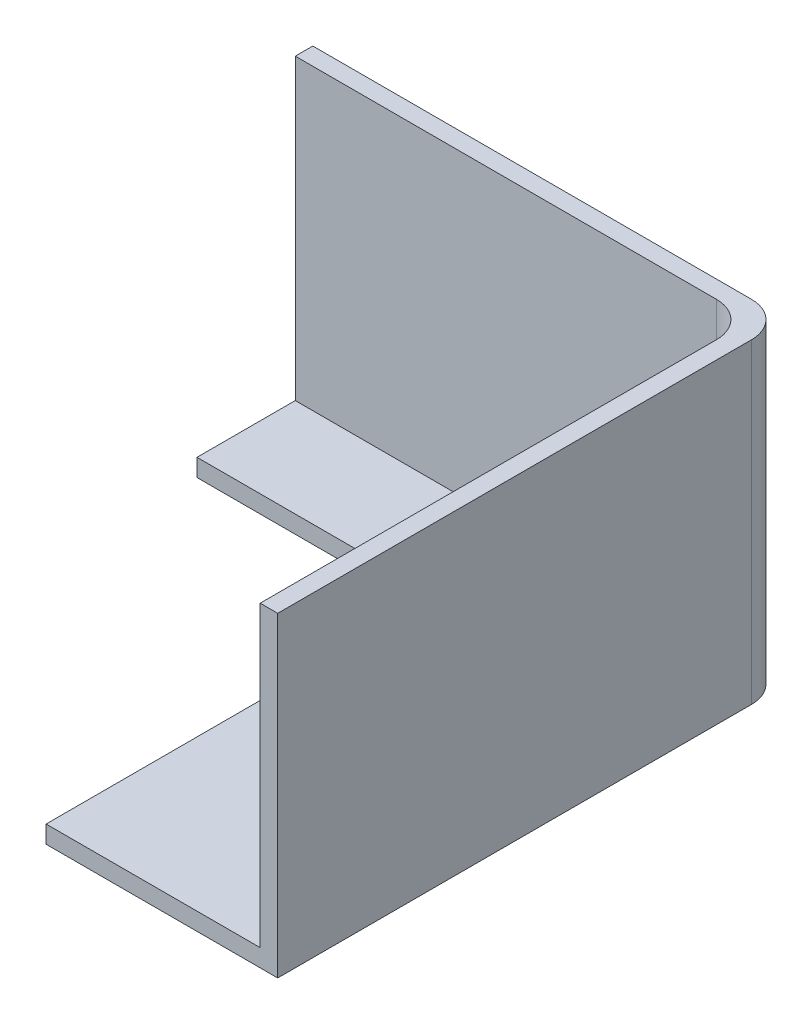
ISO-10303-21;
HEADER;
FILE_DESCRIPTION(('STEP AP214'),'2;1');
FILE_NAME('part.step','',(''),(''),'','','');
FILE_SCHEMA(('AUTOMOTIVE_DESIGN { 1 0 10303 214 1 1 1 1 }'));
ENDSEC;
DATA;
#1=APPLICATION_CONTEXT('core data for automotive mechanical design processes');
#2=APPLICATION_PROTOCOL_DEFINITION('international standard','automotive_design',2000,#1);
#3=PRODUCT_CONTEXT('',#1,'mechanical');
#4=PRODUCT('Part','Part','',(#3));
#5=PRODUCT_RELATED_PRODUCT_CATEGORY('part','',(#4));
#6=PRODUCT_DEFINITION_FORMATION('','',#4);
#7=PRODUCT_DEFINITION_CONTEXT('part definition',#1,'design');
#8=PRODUCT_DEFINITION('design','',#6,#7);
#9=PRODUCT_DEFINITION_SHAPE('','',#8);
#10=(LENGTH_UNIT() NAMED_UNIT(*) SI_UNIT(.MILLI.,.METRE.));
#11=(NAMED_UNIT(*) PLANE_ANGLE_UNIT() SI_UNIT($,.RADIAN.));
#12=(NAMED_UNIT(*) SI_UNIT($,.STERADIAN.) SOLID_ANGLE_UNIT());
#13=UNCERTAINTY_MEASURE_WITH_UNIT(LENGTH_MEASURE(1.E-05),#10,'distance_accuracy_value','');
#14=(GEOMETRIC_REPRESENTATION_CONTEXT(3) GLOBAL_UNCERTAINTY_ASSIGNED_CONTEXT((#13)) GLOBAL_UNIT_ASSIGNED_CONTEXT((#10,
#11,#12)) REPRESENTATION_CONTEXT('',''));
#15=CARTESIAN_POINT('',(0.,0.,0.));
#16=DIRECTION('',(0.,0.,1.));
#17=DIRECTION('',(1.,0.,0.));
#18=AXIS2_PLACEMENT_3D('',#15,#16,#17);
#19=CARTESIAN_POINT('',(0.,90.,0.));
#20=DIRECTION('',(1.,0.,0.));
#21=DIRECTION('',(0.,0.,-1.));
#22=AXIS2_PLACEMENT_3D('',#19,#20,#21);
#23=PLANE('',#22);
#24=DIRECTION('',(0.,0.,1.));
#25=VECTOR('',#24,1.);
#26=CARTESIAN_POINT('',(0.,0.,0.));
#27=LINE('',#26,#25);
#28=CARTESIAN_POINT('',(0.,0.,0.));
#29=VERTEX_POINT('',#28);
#30=CARTESIAN_POINT('',(0.,0.,33.));
#31=VERTEX_POINT('',#30);
#32=EDGE_CURVE('E155',#29,#31,#27,.T.);
#33=ORIENTED_EDGE('',*,*,#32,.T.);
#34=DIRECTION('',(0.,1.,0.));
#35=VECTOR('',#34,1.);
#36=CARTESIAN_POINT('',(0.,-131.54847015454,33.));
#37=LINE('',#36,#35);
#38=CARTESIAN_POINT('',(0.,5.,33.));
#39=VERTEX_POINT('',#38);
#40=EDGE_CURVE('E140',#31,#39,#37,.T.);
#41=ORIENTED_EDGE('',*,*,#40,.T.);
#42=DIRECTION('',(0.,0.,-1.));
#43=VECTOR('',#42,1.);
#44=CARTESIAN_POINT('',(0.,5.,5.));
#45=LINE('',#44,#43);
#46=CARTESIAN_POINT('',(0.,5.,5.));
#47=VERTEX_POINT('',#46);
#48=EDGE_CURVE('E152',#39,#47,#45,.T.);
#49=ORIENTED_EDGE('',*,*,#48,.T.);
#50=DIRECTION('',(0.,1.,0.));
#51=VECTOR('',#50,1.);
#52=CARTESIAN_POINT('',(0.,-191.049731745428,5.));
#53=LINE('',#52,#51);
#54=CARTESIAN_POINT('',(0.,90.,5.));
#55=VERTEX_POINT('',#54);
#56=EDGE_CURVE('E181',#47,#55,#53,.T.);
#57=ORIENTED_EDGE('',*,*,#56,.T.);
#58=DIRECTION('',(0.,0.,1.));
#59=VECTOR('',#58,1.);
#60=CARTESIAN_POINT('',(0.,90.,0.));
#61=LINE('',#60,#59);
#62=CARTESIAN_POINT('',(0.,90.,0.));
#63=VERTEX_POINT('',#62);
#64=EDGE_CURVE('E186',#63,#55,#61,.T.);
#65=ORIENTED_EDGE('',*,*,#64,.F.);
#66=DIRECTION('',(0.,-1.,0.));
#67=VECTOR('',#66,1.);
#68=CARTESIAN_POINT('',(0.,90.,0.));
#69=LINE('',#68,#67);
#70=EDGE_CURVE('E201',#63,#29,#69,.T.);
#71=ORIENTED_EDGE('',*,*,#70,.T.);
#72=EDGE_LOOP('',(#33,#41,#49,#57,#65,#71));
#73=FACE_BOUND('',#72,.T.);
#74=ADVANCED_FACE('F45',(#73),#23,.F.);
#75=CARTESIAN_POINT('',(0.,90.,145.));
#76=DIRECTION('',(0.,0.,-1.));
#77=DIRECTION('',(-1.,0.,0.));
#78=AXIS2_PLACEMENT_3D('',#75,#76,#77);
#79=PLANE('',#78);
#80=DIRECTION('',(-1.,0.,0.));
#81=VECTOR('',#80,1.);
#82=CARTESIAN_POINT('',(0.,5.,145.));
#83=LINE('',#82,#81);
#84=CARTESIAN_POINT('',(130.,5.,145.));
#85=VERTEX_POINT('',#84);
#86=CARTESIAN_POINT('',(69.,5.,145.));
#87=VERTEX_POINT('',#86);
#88=EDGE_CURVE('E163',#85,#87,#83,.T.);
#89=ORIENTED_EDGE('',*,*,#88,.T.);
#90=DIRECTION('',(0.,1.,0.));
#91=VECTOR('',#90,1.);
#92=CARTESIAN_POINT('',(69.,-131.54847015454,145.));
#93=LINE('',#92,#91);
#94=CARTESIAN_POINT('',(69.,0.,145.));
#95=VERTEX_POINT('',#94);
#96=EDGE_CURVE('E146',#95,#87,#93,.T.);
#97=ORIENTED_EDGE('',*,*,#96,.F.);
#98=DIRECTION('',(1.,0.,0.));
#99=VECTOR('',#98,1.);
#100=CARTESIAN_POINT('',(0.,0.,145.));
#101=LINE('',#100,#99);
#102=CARTESIAN_POINT('',(135.,0.,145.));
#103=VERTEX_POINT('',#102);
#104=EDGE_CURVE('E204',#95,#103,#101,.T.);
#105=ORIENTED_EDGE('',*,*,#104,.T.);
#106=DIRECTION('',(0.,-1.,0.));
#107=VECTOR('',#106,1.);
#108=CARTESIAN_POINT('',(135.,90.,145.));
#109=LINE('',#108,#107);
#110=CARTESIAN_POINT('',(135.,90.,145.));
#111=VERTEX_POINT('',#110);
#112=EDGE_CURVE('E215',#111,#103,#109,.T.);
#113=ORIENTED_EDGE('',*,*,#112,.F.);
#114=DIRECTION('',(1.,0.,0.));
#115=VECTOR('',#114,1.);
#116=CARTESIAN_POINT('',(0.,90.,145.));
#117=LINE('',#116,#115);
#118=CARTESIAN_POINT('',(130.,90.,145.));
#119=VERTEX_POINT('',#118);
#120=EDGE_CURVE('E190',#119,#111,#117,.T.);
#121=ORIENTED_EDGE('',*,*,#120,.F.);
#122=DIRECTION('',(0.,1.,0.));
#123=VECTOR('',#122,1.);
#124=CARTESIAN_POINT('',(130.,-191.049731745428,145.));
#125=LINE('',#124,#123);
#126=EDGE_CURVE('E180',#85,#119,#125,.T.);
#127=ORIENTED_EDGE('',*,*,#126,.F.);
#128=EDGE_LOOP('',(#89,#97,#105,#113,#121,#127));
#129=FACE_BOUND('',#128,.T.);
#130=ADVANCED_FACE('F281',(#129),#79,.F.);
#131=CARTESIAN_POINT('',(135.,90.,0.));
#132=DIRECTION('',(-1.,0.,0.));
#133=DIRECTION('',(0.,0.,1.));
#134=AXIS2_PLACEMENT_3D('',#131,#132,#133);
#135=PLANE('',#134);
#136=DIRECTION('',(0.,0.,-1.));
#137=VECTOR('',#136,1.);
#138=CARTESIAN_POINT('',(135.,0.,0.));
#139=LINE('',#138,#137);
#140=CARTESIAN_POINT('',(135.,0.,10.));
#141=VERTEX_POINT('',#140);
#142=EDGE_CURVE('E207',#103,#141,#139,.T.);
#143=ORIENTED_EDGE('',*,*,#142,.T.);
#144=DIRECTION('',(0.,-1.,0.));
#145=VECTOR('',#144,1.);
#146=CARTESIAN_POINT('',(135.,90.,10.));
#147=LINE('',#146,#145);
#148=CARTESIAN_POINT('',(135.,90.,10.));
#149=VERTEX_POINT('',#148);
#150=EDGE_CURVE('E231',#141,#149,#147,.F.);
#151=ORIENTED_EDGE('',*,*,#150,.T.);
#152=DIRECTION('',(0.,0.,-1.));
#153=VECTOR('',#152,1.);
#154=CARTESIAN_POINT('',(135.,90.,0.));
#155=LINE('',#154,#153);
#156=EDGE_CURVE('E194',#111,#149,#155,.T.);
#157=ORIENTED_EDGE('',*,*,#156,.F.);
#158=ORIENTED_EDGE('',*,*,#112,.T.);
#159=EDGE_LOOP('',(#143,#151,#157,#158));
#160=FACE_BOUND('',#159,.T.);
#161=ADVANCED_FACE('F303',(#160),#135,.F.);
#162=CARTESIAN_POINT('',(0.,90.,0.));
#163=DIRECTION('',(0.,0.,1.));
#164=DIRECTION('',(1.,0.,0.));
#165=AXIS2_PLACEMENT_3D('',#162,#163,#164);
#166=PLANE('',#165);
#167=DIRECTION('',(-1.,0.,0.));
#168=VECTOR('',#167,1.);
#169=CARTESIAN_POINT('',(0.,90.,0.));
#170=LINE('',#169,#168);
#171=CARTESIAN_POINT('',(125.,90.,0.));
#172=VERTEX_POINT('',#171);
#173=EDGE_CURVE('E198',#172,#63,#170,.T.);
#174=ORIENTED_EDGE('',*,*,#173,.F.);
#175=DIRECTION('',(0.,-1.,0.));
#176=VECTOR('',#175,1.);
#177=CARTESIAN_POINT('',(125.,90.,0.));
#178=LINE('',#177,#176);
#179=CARTESIAN_POINT('',(125.,0.,0.));
#180=VERTEX_POINT('',#179);
#181=EDGE_CURVE('E224',#172,#180,#178,.T.);
#182=ORIENTED_EDGE('',*,*,#181,.T.);
#183=DIRECTION('',(-1.,0.,0.));
#184=VECTOR('',#183,1.);
#185=CARTESIAN_POINT('',(0.,0.,0.));
#186=LINE('',#185,#184);
#187=EDGE_CURVE('E191',#180,#29,#186,.T.);
#188=ORIENTED_EDGE('',*,*,#187,.T.);
#189=ORIENTED_EDGE('',*,*,#70,.F.);
#190=EDGE_LOOP('',(#174,#182,#188,#189));
#191=FACE_BOUND('',#190,.T.);
#192=ADVANCED_FACE('F297',(#191),#166,.F.);
#193=CARTESIAN_POINT('',(0.,90.,0.));
#194=DIRECTION('',(0.,1.,0.));
#195=DIRECTION('',(0.,0.,1.));
#196=AXIS2_PLACEMENT_3D('',#193,#194,#195);
#197=PLANE('',#196);
#198=ORIENTED_EDGE('',*,*,#156,.T.);
#199=CARTESIAN_POINT('',(125.,90.,10.));
#200=DIRECTION('',(0.,1.,0.));
#201=DIRECTION('',(0.,0.,1.));
#202=AXIS2_PLACEMENT_3D('',#199,#200,#201);
#203=CIRCLE('',#202,10.);
#204=EDGE_CURVE('E234',#149,#172,#203,.T.);
#205=ORIENTED_EDGE('',*,*,#204,.T.);
#206=ORIENTED_EDGE('',*,*,#173,.T.);
#207=ORIENTED_EDGE('',*,*,#64,.T.);
#208=DIRECTION('',(-1.,0.,0.));
#209=VECTOR('',#208,1.);
#210=CARTESIAN_POINT('',(0.,90.,5.));
#211=LINE('',#210,#209);
#212=CARTESIAN_POINT('',(120.,90.,5.));
#213=VERTEX_POINT('',#212);
#214=EDGE_CURVE('E176',#213,#55,#211,.T.);
#215=ORIENTED_EDGE('',*,*,#214,.F.);
#216=CARTESIAN_POINT('',(120.,90.,15.));
#217=DIRECTION('',(0.,1.,0.));
#218=DIRECTION('',(0.,0.,1.));
#219=AXIS2_PLACEMENT_3D('',#216,#217,#218);
#220=CIRCLE('',#219,10.);
#221=CARTESIAN_POINT('',(130.,90.,15.));
#222=VERTEX_POINT('',#221);
#223=EDGE_CURVE('E12',#213,#222,#220,.F.);
#224=ORIENTED_EDGE('',*,*,#223,.T.);
#225=DIRECTION('',(0.,0.,-1.));
#226=VECTOR('',#225,1.);
#227=CARTESIAN_POINT('',(130.,90.,5.));
#228=LINE('',#227,#226);
#229=EDGE_CURVE('E173',#119,#222,#228,.T.);
#230=ORIENTED_EDGE('',*,*,#229,.F.);
#231=ORIENTED_EDGE('',*,*,#120,.T.);
#232=EDGE_LOOP('',(#198,#205,#206,#207,#215,#224,#230,#231));
#233=FACE_BOUND('',#232,.T.);
#234=ADVANCED_FACE('F285',(#233),#197,.T.);
#235=CARTESIAN_POINT('',(0.,0.,0.));
#236=DIRECTION('',(0.,1.,0.));
#237=DIRECTION('',(0.,0.,1.));
#238=AXIS2_PLACEMENT_3D('',#235,#236,#237);
#239=PLANE('',#238);
#240=CARTESIAN_POINT('',(64.,0.,23.));
#241=DIRECTION('',(0.,1.,0.));
#242=DIRECTION('',(0.,0.,1.));
#243=AXIS2_PLACEMENT_3D('',#240,#241,#242);
#244=CIRCLE('',#243,1.4);
#245=CARTESIAN_POINT('',(64.,0.,24.4));
#246=VERTEX_POINT('',#245);
#247=EDGE_CURVE('E266',#246,#246,#244,.F.);
#248=ORIENTED_EDGE('',*,*,#247,.F.);
#249=EDGE_LOOP('',(#248));
#250=FACE_BOUND('',#249,.T.);
#251=ORIENTED_EDGE('',*,*,#187,.F.);
#252=CARTESIAN_POINT('',(125.,0.,10.));
#253=DIRECTION('',(0.,1.,0.));
#254=DIRECTION('',(0.,0.,1.));
#255=AXIS2_PLACEMENT_3D('',#252,#253,#254);
#256=CIRCLE('',#255,10.);
#257=EDGE_CURVE('E228',#180,#141,#256,.F.);
#258=ORIENTED_EDGE('',*,*,#257,.T.);
#259=ORIENTED_EDGE('',*,*,#142,.F.);
#260=ORIENTED_EDGE('',*,*,#104,.F.);
#261=DIRECTION('',(0.,0.,1.));
#262=VECTOR('',#261,1.);
#263=CARTESIAN_POINT('',(69.,0.,33.));
#264=LINE('',#263,#262);
#265=CARTESIAN_POINT('',(69.,0.,43.));
#266=VERTEX_POINT('',#265);
#267=EDGE_CURVE('E157',#266,#95,#264,.T.);
#268=ORIENTED_EDGE('',*,*,#267,.F.);
#269=CARTESIAN_POINT('',(59.,0.,43.));
#270=DIRECTION('',(0.,1.,0.));
#271=DIRECTION('',(0.,0.,1.));
#272=AXIS2_PLACEMENT_3D('',#269,#270,#271);
#273=CIRCLE('',#272,10.);
#274=CARTESIAN_POINT('',(59.,0.,33.));
#275=VERTEX_POINT('',#274);
#276=EDGE_CURVE('E54',#266,#275,#273,.T.);
#277=ORIENTED_EDGE('',*,*,#276,.T.);
#278=DIRECTION('',(1.,0.,0.));
#279=VECTOR('',#278,1.);
#280=CARTESIAN_POINT('',(0.,0.,33.));
#281=LINE('',#280,#279);
#282=EDGE_CURVE('E177',#31,#275,#281,.T.);
#283=ORIENTED_EDGE('',*,*,#282,.F.);
#284=ORIENTED_EDGE('',*,*,#32,.F.);
#285=EDGE_LOOP('',(#251,#258,#259,#260,#268,#277,#283,#284));
#286=FACE_BOUND('',#285,.T.);
#287=ADVANCED_FACE('F252',(#250,#286),#239,.F.);
#288=CARTESIAN_POINT('',(0.,-191.049731745428,5.));
#289=DIRECTION('',(0.,0.,-1.));
#290=DIRECTION('',(-1.,0.,0.));
#291=AXIS2_PLACEMENT_3D('',#288,#289,#290);
#292=PLANE('',#291);
#293=DIRECTION('',(1.,0.,0.));
#294=VECTOR('',#293,1.);
#295=CARTESIAN_POINT('',(0.,5.,5.));
#296=LINE('',#295,#294);
#297=CARTESIAN_POINT('',(120.,5.,5.));
#298=VERTEX_POINT('',#297);
#299=EDGE_CURVE('E160',#47,#298,#296,.T.);
#300=ORIENTED_EDGE('',*,*,#299,.T.);
#301=DIRECTION('',(0.,1.,0.));
#302=VECTOR('',#301,1.);
#303=CARTESIAN_POINT('',(120.,90.,5.));
#304=LINE('',#303,#302);
#305=EDGE_CURVE('E237',#298,#213,#304,.T.);
#306=ORIENTED_EDGE('',*,*,#305,.T.);
#307=ORIENTED_EDGE('',*,*,#214,.T.);
#308=ORIENTED_EDGE('',*,*,#56,.F.);
#309=EDGE_LOOP('',(#300,#306,#307,#308));
#310=FACE_BOUND('',#309,.T.);
#311=ADVANCED_FACE('F291',(#310),#292,.F.);
#312=CARTESIAN_POINT('',(130.,-191.049731745428,5.));
#313=DIRECTION('',(1.,0.,0.));
#314=DIRECTION('',(0.,0.,-1.));
#315=AXIS2_PLACEMENT_3D('',#312,#313,#314);
#316=PLANE('',#315);
#317=ORIENTED_EDGE('',*,*,#229,.T.);
#318=DIRECTION('',(0.,1.,0.));
#319=VECTOR('',#318,1.);
#320=CARTESIAN_POINT('',(130.,5.,15.));
#321=LINE('',#320,#319);
#322=CARTESIAN_POINT('',(130.,5.,15.));
#323=VERTEX_POINT('',#322);
#324=EDGE_CURVE('E61',#222,#323,#321,.F.);
#325=ORIENTED_EDGE('',*,*,#324,.T.);
#326=DIRECTION('',(0.,0.,1.));
#327=VECTOR('',#326,1.);
#328=CARTESIAN_POINT('',(130.,5.,5.));
#329=LINE('',#328,#327);
#330=EDGE_CURVE('E169',#323,#85,#329,.T.);
#331=ORIENTED_EDGE('',*,*,#330,.T.);
#332=ORIENTED_EDGE('',*,*,#126,.T.);
#333=EDGE_LOOP('',(#317,#325,#331,#332));
#334=FACE_BOUND('',#333,.T.);
#335=ADVANCED_FACE('F276',(#334),#316,.F.);
#336=CARTESIAN_POINT('',(0.,5.,0.));
#337=DIRECTION('',(0.,1.,0.));
#338=DIRECTION('',(0.,0.,1.));
#339=AXIS2_PLACEMENT_3D('',#336,#337,#338);
#340=PLANE('',#339);
#341=CARTESIAN_POINT('',(64.,5.,23.));
#342=DIRECTION('',(0.,1.,0.));
#343=DIRECTION('',(0.,0.,1.));
#344=AXIS2_PLACEMENT_3D('',#341,#342,#343);
#345=CIRCLE('',#344,1.4);
#346=CARTESIAN_POINT('',(64.,5.,24.4));
#347=VERTEX_POINT('',#346);
#348=EDGE_CURVE('E270',#347,#347,#345,.T.);
#349=ORIENTED_EDGE('',*,*,#348,.F.);
#350=EDGE_LOOP('',(#349));
#351=FACE_BOUND('',#350,.T.);
#352=ORIENTED_EDGE('',*,*,#330,.F.);
#353=CARTESIAN_POINT('',(120.,5.,15.));
#354=DIRECTION('',(0.,1.,0.));
#355=DIRECTION('',(0.,0.,1.));
#356=AXIS2_PLACEMENT_3D('',#353,#354,#355);
#357=CIRCLE('',#356,10.);
#358=EDGE_CURVE('E68',#323,#298,#357,.T.);
#359=ORIENTED_EDGE('',*,*,#358,.T.);
#360=ORIENTED_EDGE('',*,*,#299,.F.);
#361=ORIENTED_EDGE('',*,*,#48,.F.);
#362=DIRECTION('',(-1.,0.,0.));
#363=VECTOR('',#362,1.);
#364=CARTESIAN_POINT('',(0.,5.,33.));
#365=LINE('',#364,#363);
#366=CARTESIAN_POINT('',(59.,5.,33.));
#367=VERTEX_POINT('',#366);
#368=EDGE_CURVE('E136',#367,#39,#365,.T.);
#369=ORIENTED_EDGE('',*,*,#368,.F.);
#370=CARTESIAN_POINT('',(59.,5.,43.));
#371=DIRECTION('',(0.,1.,0.));
#372=DIRECTION('',(0.,0.,1.));
#373=AXIS2_PLACEMENT_3D('',#370,#371,#372);
#374=CIRCLE('',#373,10.);
#375=CARTESIAN_POINT('',(69.,5.,43.));
#376=VERTEX_POINT('',#375);
#377=EDGE_CURVE('E245',#367,#376,#374,.F.);
#378=ORIENTED_EDGE('',*,*,#377,.T.);
#379=DIRECTION('',(0.,0.,-1.));
#380=VECTOR('',#379,1.);
#381=CARTESIAN_POINT('',(69.,5.,33.));
#382=LINE('',#381,#380);
#383=EDGE_CURVE('E147',#87,#376,#382,.T.);
#384=ORIENTED_EDGE('',*,*,#383,.F.);
#385=ORIENTED_EDGE('',*,*,#88,.F.);
#386=EDGE_LOOP('',(#352,#359,#360,#361,#369,#378,#384,#385));
#387=FACE_BOUND('',#386,.T.);
#388=ADVANCED_FACE('F159',(#351,#387),#340,.T.);
#389=CARTESIAN_POINT('',(0.,-131.54847015454,33.));
#390=DIRECTION('',(0.,0.,-1.));
#391=DIRECTION('',(-1.,0.,0.));
#392=AXIS2_PLACEMENT_3D('',#389,#390,#391);
#393=PLANE('',#392);
#394=ORIENTED_EDGE('',*,*,#282,.T.);
#395=DIRECTION('',(0.,1.,0.));
#396=VECTOR('',#395,1.);
#397=CARTESIAN_POINT('',(59.,5.,33.));
#398=LINE('',#397,#396);
#399=EDGE_CURVE('E143',#275,#367,#398,.T.);
#400=ORIENTED_EDGE('',*,*,#399,.T.);
#401=ORIENTED_EDGE('',*,*,#368,.T.);
#402=ORIENTED_EDGE('',*,*,#40,.F.);
#403=EDGE_LOOP('',(#394,#400,#401,#402));
#404=FACE_BOUND('',#403,.T.);
#405=ADVANCED_FACE('F139',(#404),#393,.F.);
#406=CARTESIAN_POINT('',(69.,-131.54847015454,33.));
#407=DIRECTION('',(1.,0.,0.));
#408=DIRECTION('',(0.,0.,-1.));
#409=AXIS2_PLACEMENT_3D('',#406,#407,#408);
#410=PLANE('',#409);
#411=ORIENTED_EDGE('',*,*,#383,.T.);
#412=DIRECTION('',(0.,1.,0.));
#413=VECTOR('',#412,1.);
#414=CARTESIAN_POINT('',(69.,0.,43.));
#415=LINE('',#414,#413);
#416=EDGE_CURVE('E221',#376,#266,#415,.F.);
#417=ORIENTED_EDGE('',*,*,#416,.T.);
#418=ORIENTED_EDGE('',*,*,#267,.T.);
#419=ORIENTED_EDGE('',*,*,#96,.T.);
#420=EDGE_LOOP('',(#411,#417,#418,#419));
#421=FACE_BOUND('',#420,.T.);
#422=ADVANCED_FACE('F263',(#421),#410,.F.);
#423=CARTESIAN_POINT('',(64.,-3.95979797464467,23.));
#424=DIRECTION('',(0.,1.,0.));
#425=DIRECTION('',(0.,0.,1.));
#426=AXIS2_PLACEMENT_3D('',#423,#424,#425);
#427=CYLINDRICAL_SURFACE('',#426,1.4);
#428=ORIENTED_EDGE('',*,*,#247,.T.);
#429=EDGE_LOOP('',(#428));
#430=FACE_BOUND('',#429,.T.);
#431=ORIENTED_EDGE('',*,*,#348,.T.);
#432=EDGE_LOOP('',(#431));
#433=FACE_BOUND('',#432,.T.);
#434=ADVANCED_FACE('F318',(#430,#433),#427,.F.);
#435=CARTESIAN_POINT('',(59.,-131.54847015454,43.));
#436=DIRECTION('',(0.,-1.,0.));
#437=DIRECTION('',(0.,0.,-1.));
#438=AXIS2_PLACEMENT_3D('',#435,#436,#437);
#439=CYLINDRICAL_SURFACE('',#438,10.);
#440=ORIENTED_EDGE('',*,*,#276,.F.);
#441=ORIENTED_EDGE('',*,*,#416,.F.);
#442=ORIENTED_EDGE('',*,*,#377,.F.);
#443=ORIENTED_EDGE('',*,*,#399,.F.);
#444=EDGE_LOOP('',(#440,#441,#442,#443));
#445=FACE_BOUND('',#444,.T.);
#446=ADVANCED_FACE('F258',(#445),#439,.F.);
#447=CARTESIAN_POINT('',(125.,90.,10.));
#448=DIRECTION('',(0.,-1.,0.));
#449=DIRECTION('',(0.,0.,-1.));
#450=AXIS2_PLACEMENT_3D('',#447,#448,#449);
#451=CYLINDRICAL_SURFACE('',#450,10.);
#452=ORIENTED_EDGE('',*,*,#204,.F.);
#453=ORIENTED_EDGE('',*,*,#150,.F.);
#454=ORIENTED_EDGE('',*,*,#257,.F.);
#455=ORIENTED_EDGE('',*,*,#181,.F.);
#456=EDGE_LOOP('',(#452,#453,#454,#455));
#457=FACE_BOUND('',#456,.T.);
#458=ADVANCED_FACE('F300',(#457),#451,.T.);
#459=CARTESIAN_POINT('',(120.,-191.049731745428,15.));
#460=DIRECTION('',(0.,-1.,0.));
#461=DIRECTION('',(0.,0.,-1.));
#462=AXIS2_PLACEMENT_3D('',#459,#460,#461);
#463=CYLINDRICAL_SURFACE('',#462,10.);
#464=ORIENTED_EDGE('',*,*,#358,.F.);
#465=ORIENTED_EDGE('',*,*,#324,.F.);
#466=ORIENTED_EDGE('',*,*,#223,.F.);
#467=ORIENTED_EDGE('',*,*,#305,.F.);
#468=EDGE_LOOP('',(#464,#465,#466,#467));
#469=FACE_BOUND('',#468,.T.);
#470=ADVANCED_FACE('F47',(#469),#463,.F.);
#471=CLOSED_SHELL('',(#74,#130,#161,#192,#234,#287,#311,#335,#388,#405,#422,#434,#446,#458,#470));
#472=MANIFOLD_SOLID_BREP('B2',#471);
#473=ADVANCED_BREP_SHAPE_REPRESENTATION('',(#18,#472),#14);
#474=SHAPE_DEFINITION_REPRESENTATION(#9,#473);
ENDSEC;
END-ISO-10303-21;
